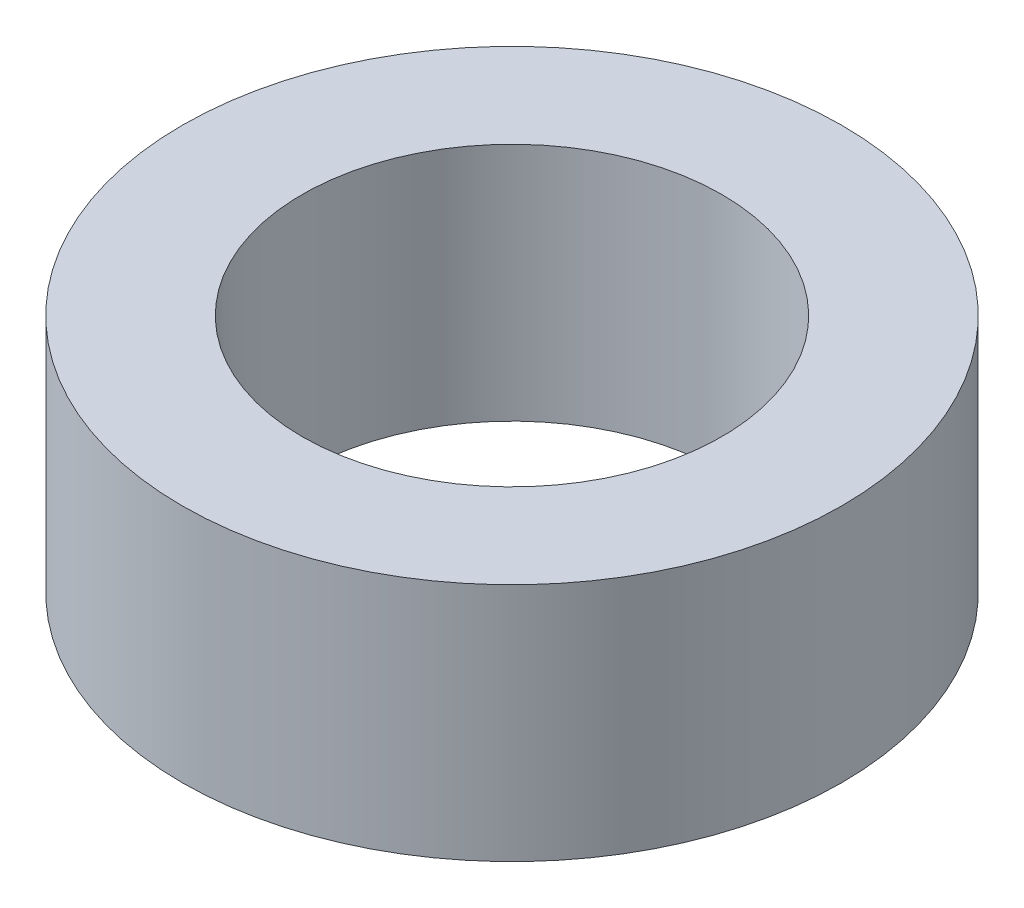
ISO-10303-21;
HEADER;
FILE_DESCRIPTION(('STEP AP214'),'2;1');
FILE_NAME('part.step','',(''),(''),'','','');
FILE_SCHEMA(('AUTOMOTIVE_DESIGN { 1 0 10303 214 1 1 1 1 }'));
ENDSEC;
DATA;
#1=APPLICATION_CONTEXT('core data for automotive mechanical design processes');
#2=APPLICATION_PROTOCOL_DEFINITION('international standard','automotive_design',2000,#1);
#3=PRODUCT_CONTEXT('',#1,'mechanical');
#4=PRODUCT('Part','Part','',(#3));
#5=PRODUCT_RELATED_PRODUCT_CATEGORY('part','',(#4));
#6=PRODUCT_DEFINITION_FORMATION('','',#4);
#7=PRODUCT_DEFINITION_CONTEXT('part definition',#1,'design');
#8=PRODUCT_DEFINITION('design','',#6,#7);
#9=PRODUCT_DEFINITION_SHAPE('','',#8);
#10=(LENGTH_UNIT() NAMED_UNIT(*) SI_UNIT(.MILLI.,.METRE.));
#11=(NAMED_UNIT(*) PLANE_ANGLE_UNIT() SI_UNIT($,.RADIAN.));
#12=(NAMED_UNIT(*) SI_UNIT($,.STERADIAN.) SOLID_ANGLE_UNIT());
#13=UNCERTAINTY_MEASURE_WITH_UNIT(LENGTH_MEASURE(1.E-05),#10,'distance_accuracy_value','');
#14=(GEOMETRIC_REPRESENTATION_CONTEXT(3) GLOBAL_UNCERTAINTY_ASSIGNED_CONTEXT((#13)) GLOBAL_UNIT_ASSIGNED_CONTEXT((#10,
#11,#12)) REPRESENTATION_CONTEXT('',''));
#15=CARTESIAN_POINT('',(0.,0.,0.));
#16=DIRECTION('',(0.,0.,1.));
#17=DIRECTION('',(1.,0.,0.));
#18=AXIS2_PLACEMENT_3D('',#15,#16,#17);
#19=CARTESIAN_POINT('',(0.,2.,0.));
#20=DIRECTION('',(0.,1.,0.));
#21=DIRECTION('',(0.,0.,1.));
#22=AXIS2_PLACEMENT_3D('',#19,#20,#21);
#23=PLANE('',#22);
#24=CARTESIAN_POINT('',(0.,2.,0.));
#25=DIRECTION('',(0.,1.,0.));
#26=DIRECTION('',(0.,0.,1.));
#27=AXIS2_PLACEMENT_3D('',#24,#25,#26);
#28=CIRCLE('',#27,2.75);
#29=CARTESIAN_POINT('',(0.,2.,2.75));
#30=VERTEX_POINT('',#29);
#31=EDGE_CURVE('E10',#30,#30,#28,.T.);
#32=ORIENTED_EDGE('',*,*,#31,.T.);
#33=EDGE_LOOP('',(#32));
#34=FACE_BOUND('',#33,.T.);
#35=CARTESIAN_POINT('',(0.,2.,0.));
#36=DIRECTION('',(0.,1.,0.));
#37=DIRECTION('',(0.,0.,1.));
#38=AXIS2_PLACEMENT_3D('',#35,#36,#37);
#39=CIRCLE('',#38,1.75);
#40=CARTESIAN_POINT('',(0.,2.,1.75));
#41=VERTEX_POINT('',#40);
#42=EDGE_CURVE('E56',#41,#41,#39,.T.);
#43=ORIENTED_EDGE('',*,*,#42,.F.);
#44=EDGE_LOOP('',(#43));
#45=FACE_BOUND('',#44,.T.);
#46=ADVANCED_FACE('F43',(#34,#45),#23,.T.);
#47=CARTESIAN_POINT('',(0.,0.,0.));
#48=DIRECTION('',(0.,1.,0.));
#49=DIRECTION('',(0.,0.,1.));
#50=AXIS2_PLACEMENT_3D('',#47,#48,#49);
#51=PLANE('',#50);
#52=CARTESIAN_POINT('',(0.,0.,0.));
#53=DIRECTION('',(0.,1.,0.));
#54=DIRECTION('',(0.,0.,1.));
#55=AXIS2_PLACEMENT_3D('',#52,#53,#54);
#56=CIRCLE('',#55,2.75);
#57=CARTESIAN_POINT('',(0.,0.,2.75));
#58=VERTEX_POINT('',#57);
#59=EDGE_CURVE('E47',#58,#58,#56,.T.);
#60=ORIENTED_EDGE('',*,*,#59,.F.);
#61=EDGE_LOOP('',(#60));
#62=FACE_BOUND('',#61,.T.);
#63=CARTESIAN_POINT('',(0.,0.,0.));
#64=DIRECTION('',(0.,1.,0.));
#65=DIRECTION('',(0.,0.,1.));
#66=AXIS2_PLACEMENT_3D('',#63,#64,#65);
#67=CIRCLE('',#66,1.75);
#68=CARTESIAN_POINT('',(0.,0.,1.75));
#69=VERTEX_POINT('',#68);
#70=EDGE_CURVE('E58',#69,#69,#67,.T.);
#71=ORIENTED_EDGE('',*,*,#70,.T.);
#72=EDGE_LOOP('',(#71));
#73=FACE_BOUND('',#72,.T.);
#74=ADVANCED_FACE('F70',(#62,#73),#51,.F.);
#75=CARTESIAN_POINT('',(0.,2.,0.));
#76=DIRECTION('',(0.,-1.,0.));
#77=DIRECTION('',(0.,0.,-1.));
#78=AXIS2_PLACEMENT_3D('',#75,#76,#77);
#79=CYLINDRICAL_SURFACE('',#78,2.75);
#80=ORIENTED_EDGE('',*,*,#31,.F.);
#81=EDGE_LOOP('',(#80));
#82=FACE_BOUND('',#81,.T.);
#83=ORIENTED_EDGE('',*,*,#59,.T.);
#84=EDGE_LOOP('',(#83));
#85=FACE_BOUND('',#84,.T.);
#86=ADVANCED_FACE('F45',(#82,#85),#79,.T.);
#87=CARTESIAN_POINT('',(0.,2.,0.));
#88=DIRECTION('',(0.,-1.,0.));
#89=DIRECTION('',(0.,0.,-1.));
#90=AXIS2_PLACEMENT_3D('',#87,#88,#89);
#91=CYLINDRICAL_SURFACE('',#90,1.75);
#92=ORIENTED_EDGE('',*,*,#42,.T.);
#93=EDGE_LOOP('',(#92));
#94=FACE_BOUND('',#93,.T.);
#95=ORIENTED_EDGE('',*,*,#70,.F.);
#96=EDGE_LOOP('',(#95));
#97=FACE_BOUND('',#96,.T.);
#98=ADVANCED_FACE('F66',(#94,#97),#91,.F.);
#99=CLOSED_SHELL('',(#46,#74,#86,#98));
#100=MANIFOLD_SOLID_BREP('B2',#99);
#101=ADVANCED_BREP_SHAPE_REPRESENTATION('',(#18,#100),#14);
#102=SHAPE_DEFINITION_REPRESENTATION(#9,#101);
ENDSEC;
END-ISO-10303-21;
